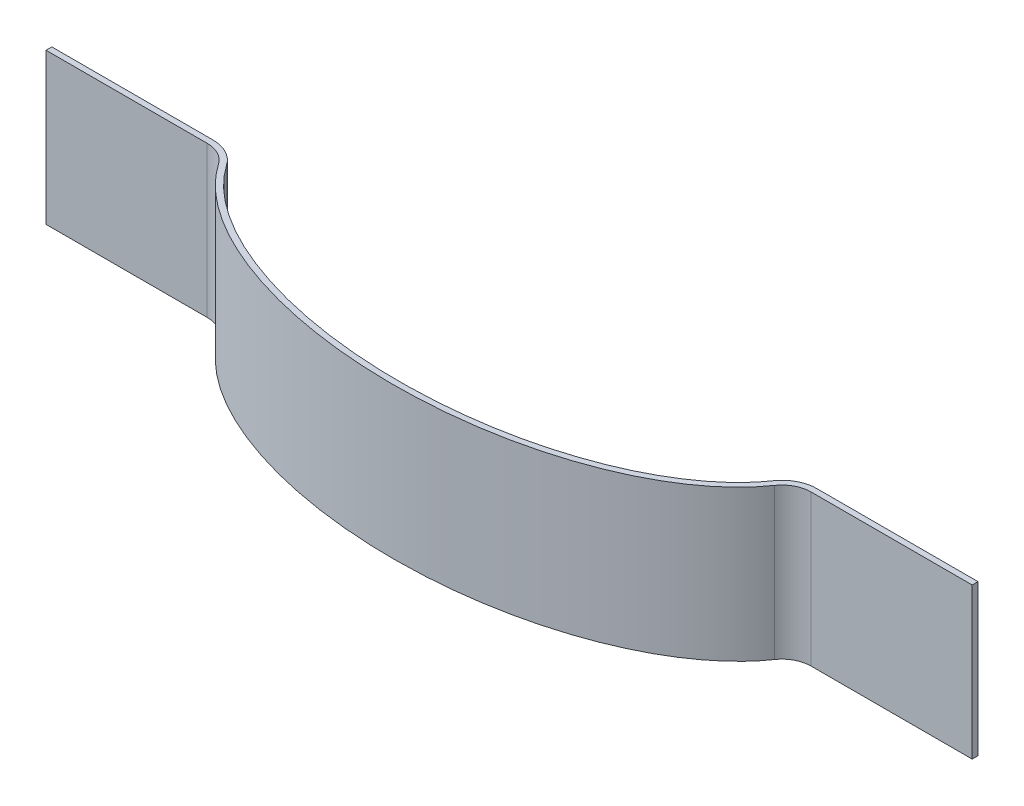
ISO-10303-21;
HEADER;
FILE_DESCRIPTION(('STEP AP214'),'2;1');
FILE_NAME('part.step','',(''),(''),'','','');
FILE_SCHEMA(('AUTOMOTIVE_DESIGN { 1 0 10303 214 1 1 1 1 }'));
ENDSEC;
DATA;
#1=APPLICATION_CONTEXT('core data for automotive mechanical design processes');
#2=APPLICATION_PROTOCOL_DEFINITION('international standard','automotive_design',2000,#1);
#3=PRODUCT_CONTEXT('',#1,'mechanical');
#4=PRODUCT('Part','Part','',(#3));
#5=PRODUCT_RELATED_PRODUCT_CATEGORY('part','',(#4));
#6=PRODUCT_DEFINITION_FORMATION('','',#4);
#7=PRODUCT_DEFINITION_CONTEXT('part definition',#1,'design');
#8=PRODUCT_DEFINITION('design','',#6,#7);
#9=PRODUCT_DEFINITION_SHAPE('','',#8);
#10=(LENGTH_UNIT() NAMED_UNIT(*) SI_UNIT(.MILLI.,.METRE.));
#11=(NAMED_UNIT(*) PLANE_ANGLE_UNIT() SI_UNIT($,.RADIAN.));
#12=(NAMED_UNIT(*) SI_UNIT($,.STERADIAN.) SOLID_ANGLE_UNIT());
#13=UNCERTAINTY_MEASURE_WITH_UNIT(LENGTH_MEASURE(1.E-05),#10,'distance_accuracy_value','');
#14=(GEOMETRIC_REPRESENTATION_CONTEXT(3) GLOBAL_UNCERTAINTY_ASSIGNED_CONTEXT((#13)) GLOBAL_UNIT_ASSIGNED_CONTEXT((#10,
#11,#12)) REPRESENTATION_CONTEXT('',''));
#15=CARTESIAN_POINT('',(0.,0.,0.));
#16=DIRECTION('',(0.,0.,1.));
#17=DIRECTION('',(1.,0.,0.));
#18=AXIS2_PLACEMENT_3D('',#15,#16,#17);
#19=CARTESIAN_POINT('',(82.8323720749977,15.9999999949704,4.99999999502958));
#20=DIRECTION('',(-1.,0.,0.));
#21=DIRECTION('',(0.,0.,1.));
#22=AXIS2_PLACEMENT_3D('',#19,#20,#21);
#23=PLANE('',#22);
#24=DIRECTION('',(0.,-1.,0.));
#25=VECTOR('',#24,1.);
#26=CARTESIAN_POINT('',(82.8323720749977,15.9999999949704,8.49999999502965));
#27=LINE('',#26,#25);
#28=CARTESIAN_POINT('',(82.8323720749977,15.9999999949704,8.49999999502965));
#29=VERTEX_POINT('',#28);
#30=CARTESIAN_POINT('',(82.8323720749977,3.,8.49999999502965));
#31=VERTEX_POINT('',#30);
#32=EDGE_CURVE('E405',#29,#31,#27,.T.);
#33=ORIENTED_EDGE('',*,*,#32,.T.);
#34=DIRECTION('',(0.,0.,-1.));
#35=VECTOR('',#34,1.);
#36=CARTESIAN_POINT('',(82.8323720749977,3.,4.99999999502958));
#37=LINE('',#36,#35);
#38=CARTESIAN_POINT('',(82.8323720749977,3.,7.99999999502962));
#39=VERTEX_POINT('',#38);
#40=EDGE_CURVE('E12',#31,#39,#37,.T.);
#41=ORIENTED_EDGE('',*,*,#40,.T.);
#42=DIRECTION('',(0.,-1.,0.));
#43=VECTOR('',#42,1.);
#44=CARTESIAN_POINT('',(82.8323720749977,15.9999999949704,7.99999999502962));
#45=LINE('',#44,#43);
#46=CARTESIAN_POINT('',(82.8323720749977,15.9999999949704,7.99999999502962));
#47=VERTEX_POINT('',#46);
#48=EDGE_CURVE('E322',#47,#39,#45,.T.);
#49=ORIENTED_EDGE('',*,*,#48,.F.);
#50=DIRECTION('',(0.,0.,-1.));
#51=VECTOR('',#50,1.);
#52=CARTESIAN_POINT('',(82.8323720749977,15.9999999949704,4.99999999502958));
#53=LINE('',#52,#51);
#54=EDGE_CURVE('E139',#29,#47,#53,.T.);
#55=ORIENTED_EDGE('',*,*,#54,.F.);
#56=EDGE_LOOP('',(#33,#41,#49,#55));
#57=FACE_BOUND('',#56,.T.);
#58=ADVANCED_FACE('F128',(#57),#23,.F.);
#59=CARTESIAN_POINT('',(3.,2.99999999999999,4.99999999502958));
#60=DIRECTION('',(1.,0.,0.));
#61=DIRECTION('',(0.,1.,0.));
#62=AXIS2_PLACEMENT_3D('',#59,#60,#61);
#63=PLANE('',#62);
#64=DIRECTION('',(0.,-1.,0.));
#65=VECTOR('',#64,1.);
#66=CARTESIAN_POINT('',(3.,15.9999999949704,8.49999999502963));
#67=LINE('',#66,#65);
#68=CARTESIAN_POINT('',(3.,15.9999999949704,8.49999999502963));
#69=VERTEX_POINT('',#68);
#70=CARTESIAN_POINT('',(3.,2.99999999999999,8.49999999502963));
#71=VERTEX_POINT('',#70);
#72=EDGE_CURVE('E400',#69,#71,#67,.T.);
#73=ORIENTED_EDGE('',*,*,#72,.F.);
#74=DIRECTION('',(0.,0.,-1.));
#75=VECTOR('',#74,1.);
#76=CARTESIAN_POINT('',(3.,15.9999999949704,4.99999999502958));
#77=LINE('',#76,#75);
#78=CARTESIAN_POINT('',(3.,15.9999999949704,7.99999999502963));
#79=VERTEX_POINT('',#78);
#80=EDGE_CURVE('E306',#69,#79,#77,.T.);
#81=ORIENTED_EDGE('',*,*,#80,.T.);
#82=DIRECTION('',(0.,-1.,0.));
#83=VECTOR('',#82,1.);
#84=CARTESIAN_POINT('',(3.,15.9999999949704,7.99999999502963));
#85=LINE('',#84,#83);
#86=CARTESIAN_POINT('',(3.,2.99999999999999,7.99999999502963));
#87=VERTEX_POINT('',#86);
#88=EDGE_CURVE('E327',#79,#87,#85,.T.);
#89=ORIENTED_EDGE('',*,*,#88,.T.);
#90=DIRECTION('',(0.,0.,-1.));
#91=VECTOR('',#90,1.);
#92=CARTESIAN_POINT('',(3.,2.99999999999999,4.99999999502958));
#93=LINE('',#92,#91);
#94=EDGE_CURVE('E304',#71,#87,#93,.T.);
#95=ORIENTED_EDGE('',*,*,#94,.F.);
#96=EDGE_LOOP('',(#73,#81,#89,#95));
#97=FACE_BOUND('',#96,.T.);
#98=ADVANCED_FACE('F263',(#97),#63,.F.);
#99=CARTESIAN_POINT('',(82.8323720749977,3.,4.99999999502958));
#100=DIRECTION('',(0.,1.,0.));
#101=DIRECTION('',(-1.,0.,0.));
#102=AXIS2_PLACEMENT_3D('',#99,#100,#101);
#103=PLANE('',#102);
#104=DIRECTION('',(-1.,0.,0.));
#105=VECTOR('',#104,1.);
#106=CARTESIAN_POINT('',(0.,2.99999999999999,8.49999999502965));
#107=LINE('',#106,#105);
#108=CARTESIAN_POINT('',(16.8897912138371,2.99999999999999,8.4999999950296));
#109=VERTEX_POINT('',#108);
#110=EDGE_CURVE('E412',#109,#71,#107,.T.);
#111=ORIENTED_EDGE('',*,*,#110,.T.);
#112=ORIENTED_EDGE('',*,*,#94,.T.);
#113=DIRECTION('',(-1.,0.,0.));
#114=VECTOR('',#113,1.);
#115=CARTESIAN_POINT('',(0.,2.99999999999999,7.99999999502965));
#116=LINE('',#115,#114);
#117=CARTESIAN_POINT('',(16.8897912138371,2.99999999999999,7.9999999950296));
#118=VERTEX_POINT('',#117);
#119=EDGE_CURVE('E289',#118,#87,#116,.T.);
#120=ORIENTED_EDGE('',*,*,#119,.F.);
#121=CARTESIAN_POINT('',(16.8897912138371,2.99999999999999,10.9999999950296));
#122=DIRECTION('',(0.,-1.,0.));
#123=DIRECTION('',(1.,0.,0.));
#124=AXIS2_PLACEMENT_3D('',#121,#122,#123);
#125=CIRCLE('',#124,3.);
#126=CARTESIAN_POINT('',(19.3612916806801,2.99999999999999,9.29950434893255));
#127=VERTEX_POINT('',#126);
#128=EDGE_CURVE('E287',#118,#127,#125,.T.);
#129=ORIENTED_EDGE('',*,*,#128,.T.);
#130=CARTESIAN_POINT('',(66.47108039932,3.,9.29950434893248));
#131=CARTESIAN_POINT('',(66.2625093934342,3.,9.6026414605151));
#132=CARTESIAN_POINT('',(66.0298672811782,3.,9.90461276729872));
#133=CARTESIAN_POINT('',(65.5222026428807,3.,10.498163814371));
#134=CARTESIAN_POINT('',(65.2466799067634,3.,10.7908052713508));
#135=CARTESIAN_POINT('',(64.3539269400569,3.,11.6566121277013));
#136=CARTESIAN_POINT('',(63.6674612534484,3.,12.2187459368349));
#137=CARTESIAN_POINT('',(62.1354626802785,3.,13.2840794547595));
#138=CARTESIAN_POINT('',(61.2865114554513,3.,13.7908025189969));
#139=CARTESIAN_POINT('',(59.4457510953051,3.,14.7297659805653));
#140=CARTESIAN_POINT('',(58.4580142649619,3.,15.1614194233413));
#141=CARTESIAN_POINT('',(56.3661207434921,3.,15.9446468277001));
#142=CARTESIAN_POINT('',(55.2620057347151,3.,16.2960324597855));
#143=CARTESIAN_POINT('',(52.9586146928244,3.,16.9068302491986));
#144=CARTESIAN_POINT('',(51.7583272462482,3.,17.1652583567247));
#145=CARTESIAN_POINT('',(48.0735745805828,3.,17.7862029151889));
#146=CARTESIAN_POINT('',(45.4986567543873,2.99999999999999,17.9999999950296));
#147=CARTESIAN_POINT('',(40.3337153256127,2.99999999999999,17.9999999950296));
#148=CARTESIAN_POINT('',(37.7587974994172,2.99999999999999,17.7862029151889));
#149=CARTESIAN_POINT('',(34.0740448337519,2.99999999999999,17.1652583567247));
#150=CARTESIAN_POINT('',(32.8737573871757,2.99999999999999,16.9068302491986));
#151=CARTESIAN_POINT('',(30.570366345285,2.99999999999999,16.2960324597855));
#152=CARTESIAN_POINT('',(29.4662513365079,2.99999999999999,15.9446468277001));
#153=CARTESIAN_POINT('',(27.3743578150381,2.99999999999999,15.1614194233413));
#154=CARTESIAN_POINT('',(26.386620984695,2.99999999999999,14.7297659805654));
#155=CARTESIAN_POINT('',(24.5458606245487,2.99999999999999,13.7908025189969));
#156=CARTESIAN_POINT('',(23.6969093997215,2.99999999999999,13.2840794547596));
#157=CARTESIAN_POINT('',(22.1649108265516,2.99999999999999,12.2187459368349));
#158=CARTESIAN_POINT('',(21.4784451399431,2.99999999999999,11.6566121277013));
#159=CARTESIAN_POINT('',(20.5856921732367,2.99999999999999,10.7908052713509));
#160=CARTESIAN_POINT('',(20.3101694371193,2.99999999999999,10.4981638143711));
#161=CARTESIAN_POINT('',(19.8025047988218,2.99999999999999,9.90461276729878));
#162=CARTESIAN_POINT('',(19.5698626865659,2.99999999999999,9.60264146051514));
#163=CARTESIAN_POINT('',(19.36129168068,2.99999999999999,9.29950434893252));
#164=B_SPLINE_CURVE_WITH_KNOTS('',3,(#130,#131,#132,#133,#134,#135,#136,#137,#138,#139,#140,
#141,#142,#143,#144,#145,#146,#147,#148,#149,#150,#151,#152,#153,#154,#155,#156,#157,#158,#159,
#160,#161,#162,#163),.UNSPECIFIED.,.F.,.F.,(4,2,2,2,2,2,2,2,2,2,2,2,2,2,2,2,4),(0.,
0.0312499999999999,0.0624999999999999,0.125,0.1875,0.25,0.3125,0.374999999999999,
0.499999999999999,0.624999999999999,0.687499999999999,0.749999999999999,0.8125,0.875,0.9375,
0.96875,1.),.UNSPECIFIED.);
#165=CARTESIAN_POINT('',(66.4710803993199,3.,9.29950434893253));
#166=VERTEX_POINT('',#165);
#167=EDGE_CURVE('E280',#166,#127,#164,.T.);
#168=ORIENTED_EDGE('',*,*,#167,.F.);
#169=CARTESIAN_POINT('',(68.9425808661629,3.,10.9999999950296));
#170=DIRECTION('',(0.,-1.,0.));
#171=DIRECTION('',(1.,0.,0.));
#172=AXIS2_PLACEMENT_3D('',#169,#170,#171);
#173=CIRCLE('',#172,2.99999999999999);
#174=CARTESIAN_POINT('',(68.9425808661629,3.,7.99999999502959));
#175=VERTEX_POINT('',#174);
#176=EDGE_CURVE('E284',#166,#175,#173,.T.);
#177=ORIENTED_EDGE('',*,*,#176,.T.);
#178=DIRECTION('',(-1.,0.,0.));
#179=VECTOR('',#178,1.);
#180=CARTESIAN_POINT('',(0.,2.99999999999999,7.99999999502933));
#181=LINE('',#180,#179);
#182=EDGE_CURVE('E369',#39,#175,#181,.T.);
#183=ORIENTED_EDGE('',*,*,#182,.F.);
#184=ORIENTED_EDGE('',*,*,#40,.F.);
#185=DIRECTION('',(-1.,0.,0.));
#186=VECTOR('',#185,1.);
#187=CARTESIAN_POINT('',(0.,2.99999999999999,8.49999999502933));
#188=LINE('',#187,#186);
#189=CARTESIAN_POINT('',(68.9425808661629,3.,8.49999999502959));
#190=VERTEX_POINT('',#189);
#191=EDGE_CURVE('E414',#31,#190,#188,.T.);
#192=ORIENTED_EDGE('',*,*,#191,.T.);
#193=CARTESIAN_POINT('',(68.9425808661629,3.,10.9999999950296));
#194=DIRECTION('',(0.,-1.,0.));
#195=DIRECTION('',(1.,0.,0.));
#196=AXIS2_PLACEMENT_3D('',#193,#194,#195);
#197=CIRCLE('',#196,2.5);
#198=CARTESIAN_POINT('',(66.8829971437937,3.,9.58292028994871));
#199=VERTEX_POINT('',#198);
#200=EDGE_CURVE('E417',#199,#190,#197,.T.);
#201=ORIENTED_EDGE('',*,*,#200,.F.);
#202=CARTESIAN_POINT('',(18.9493749362062,3.,9.5829202899487));
#203=CARTESIAN_POINT('',(19.1683315342384,3.,9.90115182173595));
#204=CARTESIAN_POINT('',(19.4118497670758,3.,10.2171166621245));
#205=CARTESIAN_POINT('',(19.9408765663748,3.,10.8356439081944));
#206=CARTESIAN_POINT('',(20.2270137138906,3.,11.1394700369024));
#207=CARTESIAN_POINT('',(21.1515167868203,3.,12.0360686807721));
#208=CARTESIAN_POINT('',(21.859353700039,3.,12.615273483214));
#209=CARTESIAN_POINT('',(23.03849955336,3.,13.4352374323093));
#210=CARTESIAN_POINT('',(23.4514529119501,3.,13.7010368660072));
#211=CARTESIAN_POINT('',(24.3165395256158,3.,14.2163598780899));
#212=CARTESIAN_POINT('',(24.7695627514679,3.,14.4662045142044));
#213=CARTESIAN_POINT('',(26.1780065872183,3.,15.1846452890459));
#214=CARTESIAN_POINT('',(27.1827618498975,3.,15.6235806900843));
#215=CARTESIAN_POINT('',(29.3072077178532,3.,16.4189960426261));
#216=CARTESIAN_POINT('',(30.426849693722,3.,16.7752562763824));
#217=CARTESIAN_POINT('',(32.7609592901583,3.,17.3941998060842));
#218=CARTESIAN_POINT('',(33.976548723167,3.,17.6558783955909));
#219=CARTESIAN_POINT('',(37.7045282720638,3.,18.2841074315649));
#220=CARTESIAN_POINT('',(40.3059513045867,3.,18.4999999950296));
#221=CARTESIAN_POINT('',(45.5264207754134,3.,18.4999999950296));
#222=CARTESIAN_POINT('',(48.1278438079362,3.,18.2841074315649));
#223=CARTESIAN_POINT('',(51.855823356833,3.,17.6558783955909));
#224=CARTESIAN_POINT('',(53.0714127898418,3.,17.3941998060842));
#225=CARTESIAN_POINT('',(55.405522386278,3.,16.7752562763824));
#226=CARTESIAN_POINT('',(56.5251643621469,3.,16.4189960426261));
#227=CARTESIAN_POINT('',(58.6496102301026,3.,15.6235806900843));
#228=CARTESIAN_POINT('',(59.6543654927817,3.,15.1846452890459));
#229=CARTESIAN_POINT('',(61.0628093285321,3.,14.4662045142044));
#230=CARTESIAN_POINT('',(61.5158325543842,3.,14.2163598780899));
#231=CARTESIAN_POINT('',(62.38091916805,3.,13.7010368660071));
#232=CARTESIAN_POINT('',(62.7938725266401,3.,13.4352374323092));
#233=CARTESIAN_POINT('',(63.973018379961,3.,12.615273483214));
#234=CARTESIAN_POINT('',(64.6808552931797,3.,12.0360686807721));
#235=CARTESIAN_POINT('',(65.6053583661094,3.00000000000001,11.1394700369024));
#236=CARTESIAN_POINT('',(65.8914955136253,3.00000000000001,10.8356439081943));
#237=CARTESIAN_POINT('',(66.4205223129243,3.00000000000001,10.2171166621244));
#238=CARTESIAN_POINT('',(66.6640405457616,3.00000000000001,9.90115182173591));
#239=CARTESIAN_POINT('',(66.8829971437938,3.00000000000001,9.58292028994865));
#240=B_SPLINE_CURVE_WITH_KNOTS('',3,(#202,#203,#204,#205,#206,#207,#208,#209,#210,#211,#212,
#213,#214,#215,#216,#217,#218,#219,#220,#221,#222,#223,#224,#225,#226,#227,#228,#229,#230,#231,
#232,#233,#234,#235,#236,#237,#238,#239),.UNSPECIFIED.,.F.,.F.,(4,2,2,2,2,2,2,2,2,2,2,2,2,2,2,2,
2,2,4),(0.,0.0312500000000001,0.0625000000000002,0.125,0.156250000000001,0.187500000000001,
0.250000000000001,0.312500000000001,0.375000000000001,0.500000000000001,0.625000000000001,
0.687500000000001,0.750000000000001,0.812500000000001,0.843750000000001,0.875,0.9375,0.96875,
1.),.UNSPECIFIED.);
#241=CARTESIAN_POINT('',(18.9493749362062,2.99999999999999,9.58292028994872));
#242=VERTEX_POINT('',#241);
#243=EDGE_CURVE('E228',#199,#242,#240,.F.);
#244=ORIENTED_EDGE('',*,*,#243,.T.);
#245=CARTESIAN_POINT('',(16.8897912138371,2.99999999999999,10.9999999950296));
#246=DIRECTION('',(0.,-1.,0.));
#247=DIRECTION('',(1.,0.,0.));
#248=AXIS2_PLACEMENT_3D('',#245,#246,#247);
#249=CIRCLE('',#248,2.5);
#250=EDGE_CURVE('E245',#109,#242,#249,.T.);
#251=ORIENTED_EDGE('',*,*,#250,.F.);
#252=EDGE_LOOP('',(#111,#112,#120,#129,#168,#177,#183,#184,#192,#201,#244,#251));
#253=FACE_BOUND('',#252,.T.);
#254=ADVANCED_FACE('F130',(#253),#103,.F.);
#255=CARTESIAN_POINT('',(3.,15.9999999949704,4.99999999502958));
#256=DIRECTION('',(0.,-1.,0.));
#257=DIRECTION('',(1.,0.,0.));
#258=AXIS2_PLACEMENT_3D('',#255,#256,#257);
#259=PLANE('',#258);
#260=DIRECTION('',(-1.,0.,0.));
#261=VECTOR('',#260,1.);
#262=CARTESIAN_POINT('',(0.,15.9999999949704,8.49999999502965));
#263=LINE('',#262,#261);
#264=CARTESIAN_POINT('',(16.8897912138371,15.9999999949704,8.4999999950296));
#265=VERTEX_POINT('',#264);
#266=EDGE_CURVE('E407',#265,#69,#263,.T.);
#267=ORIENTED_EDGE('',*,*,#266,.F.);
#268=CARTESIAN_POINT('',(16.8897912138371,15.9999999949704,10.9999999950296));
#269=DIRECTION('',(0.,-1.,0.));
#270=DIRECTION('',(1.,0.,0.));
#271=AXIS2_PLACEMENT_3D('',#268,#269,#270);
#272=CIRCLE('',#271,2.5);
#273=CARTESIAN_POINT('',(18.9493749362062,15.9999999949704,9.58292028994872));
#274=VERTEX_POINT('',#273);
#275=EDGE_CURVE('E231',#265,#274,#272,.T.);
#276=ORIENTED_EDGE('',*,*,#275,.T.);
#277=CARTESIAN_POINT('',(66.8829971437938,15.9999999949704,9.58292028994865));
#278=CARTESIAN_POINT('',(66.6640405457616,15.9999999949704,9.90115182173591));
#279=CARTESIAN_POINT('',(66.4205223129243,15.9999999949704,10.2171166621244));
#280=CARTESIAN_POINT('',(65.8914955136253,15.9999999949704,10.8356439081943));
#281=CARTESIAN_POINT('',(65.6053583661094,15.9999999949704,11.1394700369024));
#282=CARTESIAN_POINT('',(64.6808552931797,15.9999999949704,12.0360686807721));
#283=CARTESIAN_POINT('',(63.973018379961,15.9999999949704,12.615273483214));
#284=CARTESIAN_POINT('',(62.7938725266401,15.9999999949704,13.4352374323092));
#285=CARTESIAN_POINT('',(62.38091916805,15.9999999949704,13.7010368660071));
#286=CARTESIAN_POINT('',(61.5158325543842,15.9999999949704,14.2163598780899));
#287=CARTESIAN_POINT('',(61.0628093285321,15.9999999949704,14.4662045142044));
#288=CARTESIAN_POINT('',(59.6543654927817,15.9999999949704,15.1846452890459));
#289=CARTESIAN_POINT('',(58.6496102301026,15.9999999949704,15.6235806900843));
#290=CARTESIAN_POINT('',(56.5251643621469,15.9999999949704,16.4189960426261));
#291=CARTESIAN_POINT('',(55.405522386278,15.9999999949704,16.7752562763824));
#292=CARTESIAN_POINT('',(53.0714127898418,15.9999999949704,17.3941998060842));
#293=CARTESIAN_POINT('',(51.855823356833,15.9999999949704,17.6558783955909));
#294=CARTESIAN_POINT('',(48.1278438079362,15.9999999949704,18.2841074315649));
#295=CARTESIAN_POINT('',(45.5264207754134,15.9999999949704,18.4999999950296));
#296=CARTESIAN_POINT('',(40.3059513045867,15.9999999949704,18.4999999950296));
#297=CARTESIAN_POINT('',(37.7045282720638,15.9999999949704,18.2841074315649));
#298=CARTESIAN_POINT('',(33.976548723167,15.9999999949704,17.6558783955909));
#299=CARTESIAN_POINT('',(32.7609592901583,15.9999999949704,17.3941998060842));
#300=CARTESIAN_POINT('',(30.426849693722,15.9999999949704,16.7752562763824));
#301=CARTESIAN_POINT('',(29.3072077178532,15.9999999949704,16.4189960426261));
#302=CARTESIAN_POINT('',(27.1827618498974,15.9999999949704,15.6235806900843));
#303=CARTESIAN_POINT('',(26.1780065872183,15.9999999949704,15.1846452890459));
#304=CARTESIAN_POINT('',(24.7695627514679,15.9999999949704,14.4662045142044));
#305=CARTESIAN_POINT('',(24.3165395256158,15.9999999949704,14.2163598780899));
#306=CARTESIAN_POINT('',(23.4514529119501,15.9999999949704,13.7010368660072));
#307=CARTESIAN_POINT('',(23.03849955336,15.9999999949704,13.4352374323093));
#308=CARTESIAN_POINT('',(21.859353700039,15.9999999949704,12.615273483214));
#309=CARTESIAN_POINT('',(21.1515167868203,15.9999999949704,12.0360686807721));
#310=CARTESIAN_POINT('',(20.2270137138906,15.9999999949704,11.1394700369024));
#311=CARTESIAN_POINT('',(19.9408765663748,15.9999999949704,10.8356439081944));
#312=CARTESIAN_POINT('',(19.4118497670758,15.9999999949704,10.2171166621245));
#313=CARTESIAN_POINT('',(19.1683315342384,15.9999999949704,9.90115182173595));
#314=CARTESIAN_POINT('',(18.9493749362062,15.9999999949704,9.5829202899487));
#315=B_SPLINE_CURVE_WITH_KNOTS('',3,(#277,#278,#279,#280,#281,#282,#283,#284,#285,#286,#287,
#288,#289,#290,#291,#292,#293,#294,#295,#296,#297,#298,#299,#300,#301,#302,#303,#304,#305,#306,
#307,#308,#309,#310,#311,#312,#313,#314),.UNSPECIFIED.,.F.,.F.,(4,2,2,2,2,2,2,2,2,2,2,2,2,2,2,2,
2,2,4),(0.,0.0312499999999999,0.0624999999999998,0.125,0.156249999999999,0.187499999999999,
0.249999999999999,0.312499999999999,0.374999999999999,0.499999999999999,0.624999999999999,
0.687499999999999,0.749999999999999,0.812499999999999,0.843749999999999,0.875,0.9375,0.96875,
1.),.UNSPECIFIED.);
#316=CARTESIAN_POINT('',(66.8829971437937,15.9999999949704,9.58292028994871));
#317=VERTEX_POINT('',#316);
#318=EDGE_CURVE('E224',#317,#274,#315,.T.);
#319=ORIENTED_EDGE('',*,*,#318,.F.);
#320=CARTESIAN_POINT('',(68.9425808661629,15.9999999949704,10.9999999950296));
#321=DIRECTION('',(0.,-1.,0.));
#322=DIRECTION('',(1.,0.,0.));
#323=AXIS2_PLACEMENT_3D('',#320,#321,#322);
#324=CIRCLE('',#323,2.5);
#325=CARTESIAN_POINT('',(68.9425808661629,15.9999999949703,8.49999999502959));
#326=VERTEX_POINT('',#325);
#327=EDGE_CURVE('E234',#317,#326,#324,.T.);
#328=ORIENTED_EDGE('',*,*,#327,.T.);
#329=DIRECTION('',(-1.,0.,0.));
#330=VECTOR('',#329,1.);
#331=CARTESIAN_POINT('',(0.,15.9999999949704,8.49999999502933));
#332=LINE('',#331,#330);
#333=EDGE_CURVE('E238',#29,#326,#332,.T.);
#334=ORIENTED_EDGE('',*,*,#333,.F.);
#335=ORIENTED_EDGE('',*,*,#54,.T.);
#336=DIRECTION('',(-1.,0.,0.));
#337=VECTOR('',#336,1.);
#338=CARTESIAN_POINT('',(0.,15.9999999949704,7.99999999502933));
#339=LINE('',#338,#337);
#340=CARTESIAN_POINT('',(68.9425808661629,15.9999999949704,7.99999999502959));
#341=VERTEX_POINT('',#340);
#342=EDGE_CURVE('E313',#47,#341,#339,.T.);
#343=ORIENTED_EDGE('',*,*,#342,.T.);
#344=CARTESIAN_POINT('',(68.9425808661629,15.9999999949704,10.9999999950296));
#345=DIRECTION('',(0.,-1.,0.));
#346=DIRECTION('',(1.,0.,0.));
#347=AXIS2_PLACEMENT_3D('',#344,#345,#346);
#348=CIRCLE('',#347,2.99999999999999);
#349=CARTESIAN_POINT('',(66.4710803993199,15.9999999949704,9.29950434893253));
#350=VERTEX_POINT('',#349);
#351=EDGE_CURVE('E370',#350,#341,#348,.T.);
#352=ORIENTED_EDGE('',*,*,#351,.F.);
#353=CARTESIAN_POINT('',(19.36129168068,15.9999999949704,9.29950434893252));
#354=CARTESIAN_POINT('',(19.5698626865658,15.9999999949704,9.60264146051514));
#355=CARTESIAN_POINT('',(19.8025047988218,15.9999999949704,9.90461276729878));
#356=CARTESIAN_POINT('',(20.3101694371193,15.9999999949704,10.4981638143711));
#357=CARTESIAN_POINT('',(20.5856921732367,15.9999999949704,10.7908052713509));
#358=CARTESIAN_POINT('',(21.4784451399431,15.9999999949704,11.6566121277013));
#359=CARTESIAN_POINT('',(22.1649108265516,15.9999999949704,12.2187459368349));
#360=CARTESIAN_POINT('',(23.6969093997215,15.9999999949704,13.2840794547596));
#361=CARTESIAN_POINT('',(24.5458606245487,15.9999999949704,13.7908025189969));
#362=CARTESIAN_POINT('',(26.386620984695,15.9999999949704,14.7297659805654));
#363=CARTESIAN_POINT('',(27.3743578150381,15.9999999949704,15.1614194233413));
#364=CARTESIAN_POINT('',(29.4662513365079,15.9999999949704,15.9446468277001));
#365=CARTESIAN_POINT('',(30.570366345285,15.9999999949704,16.2960324597855));
#366=CARTESIAN_POINT('',(32.8737573871757,15.9999999949704,16.9068302491986));
#367=CARTESIAN_POINT('',(34.0740448337519,15.9999999949704,17.1652583567247));
#368=CARTESIAN_POINT('',(37.7587974994172,15.9999999949704,17.7862029151889));
#369=CARTESIAN_POINT('',(40.3337153256127,15.9999999949704,17.9999999950296));
#370=CARTESIAN_POINT('',(45.4986567543873,15.9999999949704,17.9999999950296));
#371=CARTESIAN_POINT('',(48.0735745805828,15.9999999949704,17.7862029151889));
#372=CARTESIAN_POINT('',(51.7583272462482,15.9999999949704,17.1652583567247));
#373=CARTESIAN_POINT('',(52.9586146928244,15.9999999949704,16.9068302491986));
#374=CARTESIAN_POINT('',(55.2620057347151,15.9999999949704,16.2960324597855));
#375=CARTESIAN_POINT('',(56.3661207434921,15.9999999949704,15.9446468277001));
#376=CARTESIAN_POINT('',(58.4580142649619,15.9999999949704,15.1614194233413));
#377=CARTESIAN_POINT('',(59.4457510953051,15.9999999949704,14.7297659805653));
#378=CARTESIAN_POINT('',(61.2865114554513,15.9999999949704,13.7908025189969));
#379=CARTESIAN_POINT('',(62.1354626802785,15.9999999949704,13.2840794547595));
#380=CARTESIAN_POINT('',(63.6674612534484,15.9999999949704,12.2187459368349));
#381=CARTESIAN_POINT('',(64.3539269400569,15.9999999949704,11.6566121277013));
#382=CARTESIAN_POINT('',(65.2466799067634,15.9999999949704,10.7908052713508));
#383=CARTESIAN_POINT('',(65.5222026428807,15.9999999949704,10.498163814371));
#384=CARTESIAN_POINT('',(66.0298672811782,15.9999999949704,9.90461276729872));
#385=CARTESIAN_POINT('',(66.2625093934342,15.9999999949704,9.6026414605151));
#386=CARTESIAN_POINT('',(66.47108039932,15.9999999949704,9.29950434893248));
#387=B_SPLINE_CURVE_WITH_KNOTS('',3,(#353,#354,#355,#356,#357,#358,#359,#360,#361,#362,#363,
#364,#365,#366,#367,#368,#369,#370,#371,#372,#373,#374,#375,#376,#377,#378,#379,#380,#381,#382,
#383,#384,#385,#386),.UNSPECIFIED.,.F.,.F.,(4,2,2,2,2,2,2,2,2,2,2,2,2,2,2,2,4),(0.,
0.0312500000000002,0.0625000000000002,0.125,0.1875,0.250000000000001,0.312500000000001,
0.375000000000001,0.500000000000001,0.625000000000001,0.6875,0.75,0.8125,0.875,0.9375,0.96875,
1.),.UNSPECIFIED.);
#388=CARTESIAN_POINT('',(19.36129168068,15.9999999949704,9.29950434893252));
#389=VERTEX_POINT('',#388);
#390=EDGE_CURVE('E337',#350,#389,#387,.F.);
#391=ORIENTED_EDGE('',*,*,#390,.T.);
#392=CARTESIAN_POINT('',(16.8897912138371,15.9999999949704,10.9999999950296));
#393=DIRECTION('',(0.,-1.,0.));
#394=DIRECTION('',(1.,0.,0.));
#395=AXIS2_PLACEMENT_3D('',#392,#393,#394);
#396=CIRCLE('',#395,3.);
#397=CARTESIAN_POINT('',(16.8897912138371,15.9999999949704,7.9999999950296));
#398=VERTEX_POINT('',#397);
#399=EDGE_CURVE('E366',#398,#389,#396,.T.);
#400=ORIENTED_EDGE('',*,*,#399,.F.);
#401=DIRECTION('',(-1.,0.,0.));
#402=VECTOR('',#401,1.);
#403=CARTESIAN_POINT('',(0.,15.9999999949704,7.99999999502965));
#404=LINE('',#403,#402);
#405=EDGE_CURVE('E324',#398,#79,#404,.T.);
#406=ORIENTED_EDGE('',*,*,#405,.T.);
#407=ORIENTED_EDGE('',*,*,#80,.F.);
#408=EDGE_LOOP('',(#267,#276,#319,#328,#334,#335,#343,#352,#391,#400,#406,#407));
#409=FACE_BOUND('',#408,.T.);
#410=ADVANCED_FACE('F243',(#409),#259,.F.);
#411=CARTESIAN_POINT('',(68.9425808661629,15.9999999949704,10.9999999950296));
#412=DIRECTION('',(0.,-1.,0.));
#413=DIRECTION('',(1.,0.,0.));
#414=AXIS2_PLACEMENT_3D('',#411,#412,#413);
#415=CYLINDRICAL_SURFACE('',#414,2.99999999999999);
#416=ORIENTED_EDGE('',*,*,#176,.F.);
#417=DIRECTION('',(0.,-1.,0.));
#418=VECTOR('',#417,1.);
#419=CARTESIAN_POINT('',(66.4710803993199,15.9999999949704,9.29950434893253));
#420=LINE('',#419,#418);
#421=EDGE_CURVE('E323',#350,#166,#420,.T.);
#422=ORIENTED_EDGE('',*,*,#421,.F.);
#423=ORIENTED_EDGE('',*,*,#351,.T.);
#424=DIRECTION('',(0.,-1.,0.));
#425=VECTOR('',#424,1.);
#426=CARTESIAN_POINT('',(68.9425808661629,15.9999999949704,7.99999999502959));
#427=LINE('',#426,#425);
#428=EDGE_CURVE('E307',#341,#175,#427,.T.);
#429=ORIENTED_EDGE('',*,*,#428,.T.);
#430=EDGE_LOOP('',(#416,#422,#423,#429));
#431=FACE_BOUND('',#430,.T.);
#432=ADVANCED_FACE('F262',(#431),#415,.T.);
#433=CARTESIAN_POINT('',(0.,15.9999999949704,7.99999999502933));
#434=DIRECTION('',(0.,0.,1.));
#435=DIRECTION('',(1.,0.,0.));
#436=AXIS2_PLACEMENT_3D('',#433,#434,#435);
#437=PLANE('',#436);
#438=ORIENTED_EDGE('',*,*,#182,.T.);
#439=ORIENTED_EDGE('',*,*,#428,.F.);
#440=ORIENTED_EDGE('',*,*,#342,.F.);
#441=ORIENTED_EDGE('',*,*,#48,.T.);
#442=EDGE_LOOP('',(#438,#439,#440,#441));
#443=FACE_BOUND('',#442,.T.);
#444=ADVANCED_FACE('F321',(#443),#437,.F.);
#445=CARTESIAN_POINT('',(0.,15.9999999949704,7.99999999502965));
#446=DIRECTION('',(0.,0.,1.));
#447=DIRECTION('',(1.,0.,0.));
#448=AXIS2_PLACEMENT_3D('',#445,#446,#447);
#449=PLANE('',#448);
#450=ORIENTED_EDGE('',*,*,#119,.T.);
#451=ORIENTED_EDGE('',*,*,#88,.F.);
#452=ORIENTED_EDGE('',*,*,#405,.F.);
#453=DIRECTION('',(0.,-1.,0.));
#454=VECTOR('',#453,1.);
#455=CARTESIAN_POINT('',(16.8897912138371,15.9999999949704,7.9999999950296));
#456=LINE('',#455,#454);
#457=EDGE_CURVE('E331',#398,#118,#456,.T.);
#458=ORIENTED_EDGE('',*,*,#457,.T.);
#459=EDGE_LOOP('',(#450,#451,#452,#458));
#460=FACE_BOUND('',#459,.T.);
#461=ADVANCED_FACE('F388',(#460),#449,.F.);
#462=CARTESIAN_POINT('',(16.8897912138371,15.9999999949704,10.9999999950296));
#463=DIRECTION('',(0.,-1.,0.));
#464=DIRECTION('',(1.,0.,0.));
#465=AXIS2_PLACEMENT_3D('',#462,#463,#464);
#466=CYLINDRICAL_SURFACE('',#465,3.);
#467=ORIENTED_EDGE('',*,*,#128,.F.);
#468=ORIENTED_EDGE('',*,*,#457,.F.);
#469=ORIENTED_EDGE('',*,*,#399,.T.);
#470=DIRECTION('',(0.,-1.,0.));
#471=VECTOR('',#470,1.);
#472=CARTESIAN_POINT('',(19.3612916806801,15.9999999949704,9.29950434893255));
#473=LINE('',#472,#471);
#474=EDGE_CURVE('E155',#389,#127,#473,.T.);
#475=ORIENTED_EDGE('',*,*,#474,.T.);
#476=EDGE_LOOP('',(#467,#468,#469,#475));
#477=FACE_BOUND('',#476,.T.);
#478=ADVANCED_FACE('F352',(#477),#466,.T.);
#479=CARTESIAN_POINT('',(66.47108039932,15.9999999949704,9.29950434893248));
#480=CARTESIAN_POINT('',(66.2625093934342,15.9999999949704,9.6026414605151));
#481=CARTESIAN_POINT('',(66.0298672811782,15.9999999949704,9.90461276729872));
#482=CARTESIAN_POINT('',(65.5222026428807,15.9999999949704,10.498163814371));
#483=CARTESIAN_POINT('',(65.2466799067634,15.9999999949704,10.7908052713508));
#484=CARTESIAN_POINT('',(64.3539269400569,15.9999999949704,11.6566121277013));
#485=CARTESIAN_POINT('',(63.6674612534484,15.9999999949704,12.2187459368349));
#486=CARTESIAN_POINT('',(62.1354626802785,15.9999999949704,13.2840794547595));
#487=CARTESIAN_POINT('',(61.2865114554513,15.9999999949704,13.7908025189969));
#488=CARTESIAN_POINT('',(59.4457510953051,15.9999999949704,14.7297659805653));
#489=CARTESIAN_POINT('',(58.4580142649619,15.9999999949704,15.1614194233413));
#490=CARTESIAN_POINT('',(56.3661207434921,15.9999999949704,15.9446468277001));
#491=CARTESIAN_POINT('',(55.2620057347151,15.9999999949704,16.2960324597855));
#492=CARTESIAN_POINT('',(52.9586146928244,15.9999999949704,16.9068302491986));
#493=CARTESIAN_POINT('',(51.7583272462482,15.9999999949704,17.1652583567247));
#494=CARTESIAN_POINT('',(48.0735745805828,15.9999999949704,17.7862029151889));
#495=CARTESIAN_POINT('',(45.4986567543873,15.9999999949704,17.9999999950296));
#496=CARTESIAN_POINT('',(40.3337153256127,15.9999999949704,17.9999999950296));
#497=CARTESIAN_POINT('',(37.7587974994172,15.9999999949704,17.7862029151889));
#498=CARTESIAN_POINT('',(34.0740448337519,15.9999999949704,17.1652583567247));
#499=CARTESIAN_POINT('',(32.8737573871757,15.9999999949704,16.9068302491986));
#500=CARTESIAN_POINT('',(30.570366345285,15.9999999949704,16.2960324597855));
#501=CARTESIAN_POINT('',(29.4662513365079,15.9999999949704,15.9446468277001));
#502=CARTESIAN_POINT('',(27.3743578150381,15.9999999949704,15.1614194233413));
#503=CARTESIAN_POINT('',(26.386620984695,15.9999999949704,14.7297659805654));
#504=CARTESIAN_POINT('',(24.5458606245487,15.9999999949704,13.7908025189969));
#505=CARTESIAN_POINT('',(23.6969093997215,15.9999999949704,13.2840794547596));
#506=CARTESIAN_POINT('',(22.1649108265516,15.9999999949704,12.2187459368349));
#507=CARTESIAN_POINT('',(21.4784451399431,15.9999999949704,11.6566121277013));
#508=CARTESIAN_POINT('',(20.5856921732367,15.9999999949704,10.7908052713509));
#509=CARTESIAN_POINT('',(20.3101694371193,15.9999999949704,10.4981638143711));
#510=CARTESIAN_POINT('',(19.8025047988218,15.9999999949704,9.90461276729878));
#511=CARTESIAN_POINT('',(19.5698626865658,15.9999999949704,9.60264146051514));
#512=CARTESIAN_POINT('',(19.36129168068,15.9999999949704,9.29950434893252));
#513=B_SPLINE_CURVE_WITH_KNOTS('',3,(#479,#480,#481,#482,#483,#484,#485,#486,#487,#488,#489,
#490,#491,#492,#493,#494,#495,#496,#497,#498,#499,#500,#501,#502,#503,#504,#505,#506,#507,#508,
#509,#510,#511,#512),.UNSPECIFIED.,.F.,.F.,(4,2,2,2,2,2,2,2,2,2,2,2,2,2,2,2,4),(0.,
0.0312499999999999,0.0624999999999999,0.125,0.1875,0.25,0.3125,0.374999999999999,
0.499999999999999,0.624999999999999,0.687499999999999,0.749999999999999,0.8125,0.875,0.9375,
0.96875,1.),.UNSPECIFIED.);
#514=DIRECTION('',(0.,-1.,0.));
#515=VECTOR('',#514,1.);
#516=SURFACE_OF_LINEAR_EXTRUSION('',#513,#515);
#517=ORIENTED_EDGE('',*,*,#167,.T.);
#518=ORIENTED_EDGE('',*,*,#474,.F.);
#519=ORIENTED_EDGE('',*,*,#390,.F.);
#520=ORIENTED_EDGE('',*,*,#421,.T.);
#521=EDGE_LOOP('',(#517,#518,#519,#520));
#522=FACE_BOUND('',#521,.T.);
#523=ADVANCED_FACE('F342',(#522),#516,.F.);
#524=CARTESIAN_POINT('',(66.8829971437938,15.9999999949704,9.58292028994865));
#525=CARTESIAN_POINT('',(66.6640405457616,15.9999999949704,9.90115182173591));
#526=CARTESIAN_POINT('',(66.4205223129243,15.9999999949704,10.2171166621244));
#527=CARTESIAN_POINT('',(65.8914955136253,15.9999999949704,10.8356439081943));
#528=CARTESIAN_POINT('',(65.6053583661094,15.9999999949704,11.1394700369024));
#529=CARTESIAN_POINT('',(64.6808552931797,15.9999999949704,12.0360686807721));
#530=CARTESIAN_POINT('',(63.973018379961,15.9999999949704,12.615273483214));
#531=CARTESIAN_POINT('',(62.7938725266401,15.9999999949704,13.4352374323092));
#532=CARTESIAN_POINT('',(62.38091916805,15.9999999949704,13.7010368660071));
#533=CARTESIAN_POINT('',(61.5158325543842,15.9999999949704,14.2163598780899));
#534=CARTESIAN_POINT('',(61.0628093285321,15.9999999949704,14.4662045142044));
#535=CARTESIAN_POINT('',(59.6543654927817,15.9999999949704,15.1846452890459));
#536=CARTESIAN_POINT('',(58.6496102301026,15.9999999949704,15.6235806900843));
#537=CARTESIAN_POINT('',(56.5251643621469,15.9999999949704,16.4189960426261));
#538=CARTESIAN_POINT('',(55.405522386278,15.9999999949704,16.7752562763824));
#539=CARTESIAN_POINT('',(53.0714127898418,15.9999999949704,17.3941998060842));
#540=CARTESIAN_POINT('',(51.855823356833,15.9999999949704,17.6558783955909));
#541=CARTESIAN_POINT('',(48.1278438079362,15.9999999949704,18.2841074315649));
#542=CARTESIAN_POINT('',(45.5264207754134,15.9999999949704,18.4999999950296));
#543=CARTESIAN_POINT('',(40.3059513045867,15.9999999949704,18.4999999950296));
#544=CARTESIAN_POINT('',(37.7045282720638,15.9999999949704,18.2841074315649));
#545=CARTESIAN_POINT('',(33.976548723167,15.9999999949704,17.6558783955909));
#546=CARTESIAN_POINT('',(32.7609592901583,15.9999999949704,17.3941998060842));
#547=CARTESIAN_POINT('',(30.426849693722,15.9999999949704,16.7752562763824));
#548=CARTESIAN_POINT('',(29.3072077178532,15.9999999949704,16.4189960426261));
#549=CARTESIAN_POINT('',(27.1827618498974,15.9999999949704,15.6235806900843));
#550=CARTESIAN_POINT('',(26.1780065872183,15.9999999949704,15.1846452890459));
#551=CARTESIAN_POINT('',(24.7695627514679,15.9999999949704,14.4662045142044));
#552=CARTESIAN_POINT('',(24.3165395256158,15.9999999949704,14.2163598780899));
#553=CARTESIAN_POINT('',(23.4514529119501,15.9999999949704,13.7010368660072));
#554=CARTESIAN_POINT('',(23.03849955336,15.9999999949704,13.4352374323093));
#555=CARTESIAN_POINT('',(21.859353700039,15.9999999949704,12.615273483214));
#556=CARTESIAN_POINT('',(21.1515167868203,15.9999999949704,12.0360686807721));
#557=CARTESIAN_POINT('',(20.2270137138906,15.9999999949704,11.1394700369024));
#558=CARTESIAN_POINT('',(19.9408765663748,15.9999999949704,10.8356439081944));
#559=CARTESIAN_POINT('',(19.4118497670758,15.9999999949704,10.2171166621245));
#560=CARTESIAN_POINT('',(19.1683315342384,15.9999999949704,9.90115182173595));
#561=CARTESIAN_POINT('',(18.9493749362062,15.9999999949704,9.5829202899487));
#562=B_SPLINE_CURVE_WITH_KNOTS('',3,(#524,#525,#526,#527,#528,#529,#530,#531,#532,#533,#534,
#535,#536,#537,#538,#539,#540,#541,#542,#543,#544,#545,#546,#547,#548,#549,#550,#551,#552,#553,
#554,#555,#556,#557,#558,#559,#560,#561),.UNSPECIFIED.,.F.,.F.,(4,2,2,2,2,2,2,2,2,2,2,2,2,2,2,2,
2,2,4),(0.,0.0312499999999999,0.0624999999999998,0.125,0.156249999999999,0.187499999999999,
0.249999999999999,0.312499999999999,0.374999999999999,0.499999999999999,0.624999999999999,
0.687499999999999,0.749999999999999,0.812499999999999,0.843749999999999,0.875,0.9375,0.96875,
1.),.UNSPECIFIED.);
#563=DIRECTION('',(0.,-1.,0.));
#564=VECTOR('',#563,1.);
#565=SURFACE_OF_LINEAR_EXTRUSION('',#562,#564);
#566=ORIENTED_EDGE('',*,*,#243,.F.);
#567=DIRECTION('',(0.,-1.,0.));
#568=VECTOR('',#567,1.);
#569=CARTESIAN_POINT('',(66.8829971437937,15.9999999949704,9.58292028994871));
#570=LINE('',#569,#568);
#571=EDGE_CURVE('E221',#317,#199,#570,.T.);
#572=ORIENTED_EDGE('',*,*,#571,.F.);
#573=ORIENTED_EDGE('',*,*,#318,.T.);
#574=DIRECTION('',(0.,-1.,0.));
#575=VECTOR('',#574,1.);
#576=CARTESIAN_POINT('',(18.9493749362062,15.9999999949704,9.58292028994872));
#577=LINE('',#576,#575);
#578=EDGE_CURVE('E291',#274,#242,#577,.T.);
#579=ORIENTED_EDGE('',*,*,#578,.T.);
#580=EDGE_LOOP('',(#566,#572,#573,#579));
#581=FACE_BOUND('',#580,.T.);
#582=ADVANCED_FACE('F222',(#581),#565,.T.);
#583=CARTESIAN_POINT('',(16.8897912138371,15.9999999949704,10.9999999950296));
#584=DIRECTION('',(0.,-1.,0.));
#585=DIRECTION('',(1.,0.,0.));
#586=AXIS2_PLACEMENT_3D('',#583,#584,#585);
#587=CYLINDRICAL_SURFACE('',#586,2.5);
#588=ORIENTED_EDGE('',*,*,#250,.T.);
#589=ORIENTED_EDGE('',*,*,#578,.F.);
#590=ORIENTED_EDGE('',*,*,#275,.F.);
#591=DIRECTION('',(0.,-1.,0.));
#592=VECTOR('',#591,1.);
#593=CARTESIAN_POINT('',(16.8897912138371,15.9999999949704,8.4999999950296));
#594=LINE('',#593,#592);
#595=EDGE_CURVE('E293',#265,#109,#594,.T.);
#596=ORIENTED_EDGE('',*,*,#595,.T.);
#597=EDGE_LOOP('',(#588,#589,#590,#596));
#598=FACE_BOUND('',#597,.T.);
#599=ADVANCED_FACE('F437',(#598),#587,.F.);
#600=CARTESIAN_POINT('',(0.,15.9999999949704,8.49999999502965));
#601=DIRECTION('',(0.,0.,1.));
#602=DIRECTION('',(1.,0.,0.));
#603=AXIS2_PLACEMENT_3D('',#600,#601,#602);
#604=PLANE('',#603);
#605=ORIENTED_EDGE('',*,*,#110,.F.);
#606=ORIENTED_EDGE('',*,*,#595,.F.);
#607=ORIENTED_EDGE('',*,*,#266,.T.);
#608=ORIENTED_EDGE('',*,*,#72,.T.);
#609=EDGE_LOOP('',(#605,#606,#607,#608));
#610=FACE_BOUND('',#609,.T.);
#611=ADVANCED_FACE('F466',(#610),#604,.T.);
#612=CARTESIAN_POINT('',(0.,15.9999999949704,8.49999999502933));
#613=DIRECTION('',(0.,0.,1.));
#614=DIRECTION('',(1.,0.,0.));
#615=AXIS2_PLACEMENT_3D('',#612,#613,#614);
#616=PLANE('',#615);
#617=ORIENTED_EDGE('',*,*,#191,.F.);
#618=ORIENTED_EDGE('',*,*,#32,.F.);
#619=ORIENTED_EDGE('',*,*,#333,.T.);
#620=DIRECTION('',(0.,-1.,0.));
#621=VECTOR('',#620,1.);
#622=CARTESIAN_POINT('',(68.9425808661629,15.9999999949704,8.49999999502959));
#623=LINE('',#622,#621);
#624=EDGE_CURVE('E147',#326,#190,#623,.T.);
#625=ORIENTED_EDGE('',*,*,#624,.T.);
#626=EDGE_LOOP('',(#617,#618,#619,#625));
#627=FACE_BOUND('',#626,.T.);
#628=ADVANCED_FACE('F464',(#627),#616,.T.);
#629=CARTESIAN_POINT('',(68.9425808661629,15.9999999949704,10.9999999950296));
#630=DIRECTION('',(0.,-1.,0.));
#631=DIRECTION('',(1.,0.,0.));
#632=AXIS2_PLACEMENT_3D('',#629,#630,#631);
#633=CYLINDRICAL_SURFACE('',#632,2.5);
#634=ORIENTED_EDGE('',*,*,#200,.T.);
#635=ORIENTED_EDGE('',*,*,#624,.F.);
#636=ORIENTED_EDGE('',*,*,#327,.F.);
#637=ORIENTED_EDGE('',*,*,#571,.T.);
#638=EDGE_LOOP('',(#634,#635,#636,#637));
#639=FACE_BOUND('',#638,.T.);
#640=ADVANCED_FACE('F235',(#639),#633,.F.);
#641=CLOSED_SHELL('',(#58,#98,#254,#410,#432,#444,#461,#478,#523,#582,#599,#611,#628,#640));
#642=MANIFOLD_SOLID_BREP('B2',#641);
#643=ADVANCED_BREP_SHAPE_REPRESENTATION('',(#18,#642),#14);
#644=SHAPE_DEFINITION_REPRESENTATION(#9,#643);
ENDSEC;
END-ISO-10303-21;
